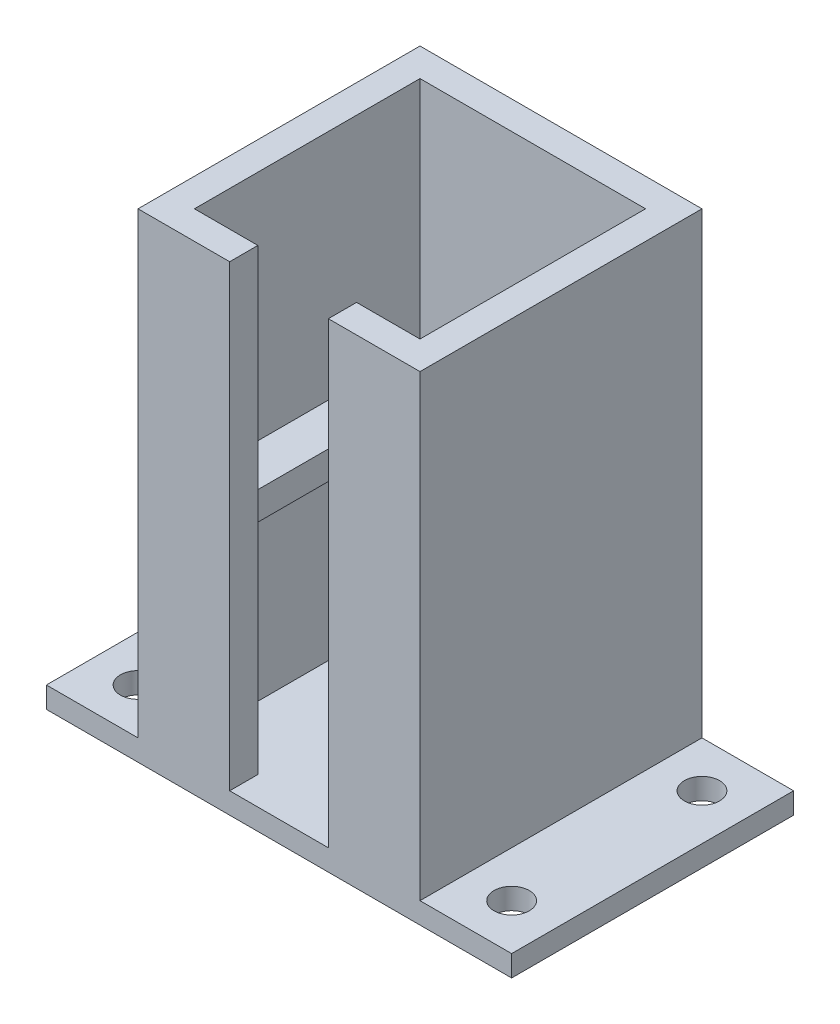
ISO-10303-21;
HEADER;
FILE_DESCRIPTION(('STEP AP214'),'2;1');
FILE_NAME('part.step','',(''),(''),'','','');
FILE_SCHEMA(('AUTOMOTIVE_DESIGN { 1 0 10303 214 1 1 1 1 }'));
ENDSEC;
DATA;
#1=APPLICATION_CONTEXT('core data for automotive mechanical design processes');
#2=APPLICATION_PROTOCOL_DEFINITION('international standard','automotive_design',2000,#1);
#3=PRODUCT_CONTEXT('',#1,'mechanical');
#4=PRODUCT('Part','Part','',(#3));
#5=PRODUCT_RELATED_PRODUCT_CATEGORY('part','',(#4));
#6=PRODUCT_DEFINITION_FORMATION('','',#4);
#7=PRODUCT_DEFINITION_CONTEXT('part definition',#1,'design');
#8=PRODUCT_DEFINITION('design','',#6,#7);
#9=PRODUCT_DEFINITION_SHAPE('','',#8);
#10=(LENGTH_UNIT() NAMED_UNIT(*) SI_UNIT(.MILLI.,.METRE.));
#11=(NAMED_UNIT(*) PLANE_ANGLE_UNIT() SI_UNIT($,.RADIAN.));
#12=(NAMED_UNIT(*) SI_UNIT($,.STERADIAN.) SOLID_ANGLE_UNIT());
#13=UNCERTAINTY_MEASURE_WITH_UNIT(LENGTH_MEASURE(1.E-05),#10,'distance_accuracy_value','');
#14=(GEOMETRIC_REPRESENTATION_CONTEXT(3) GLOBAL_UNCERTAINTY_ASSIGNED_CONTEXT((#13)) GLOBAL_UNIT_ASSIGNED_CONTEXT((#10,
#11,#12)) REPRESENTATION_CONTEXT('',''));
#15=CARTESIAN_POINT('',(0.,0.,0.));
#16=DIRECTION('',(0.,0.,1.));
#17=DIRECTION('',(1.,0.,0.));
#18=AXIS2_PLACEMENT_3D('',#15,#16,#17);
#19=CARTESIAN_POINT('',(-94.7040678384791,68.,-61.9948726358178));
#20=DIRECTION('',(0.,0.,-1.));
#21=DIRECTION('',(-1.,0.,0.));
#22=AXIS2_PLACEMENT_3D('',#19,#20,#21);
#23=PLANE('',#22);
#24=DIRECTION('',(-1.,0.,0.));
#25=VECTOR('',#24,1.);
#26=CARTESIAN_POINT('',(-62.7040678384791,35.,-61.9948726358178));
#27=LINE('',#26,#25);
#28=CARTESIAN_POINT('',(-62.7040678384791,35.,-61.9948726358178));
#29=VERTEX_POINT('',#28);
#30=CARTESIAN_POINT('',(-68.7040678384791,35.,-61.9948726358178));
#31=VERTEX_POINT('',#30);
#32=EDGE_CURVE('E294',#29,#31,#27,.T.);
#33=ORIENTED_EDGE('',*,*,#32,.F.);
#34=DIRECTION('',(0.,-1.,0.));
#35=VECTOR('',#34,1.);
#36=CARTESIAN_POINT('',(-62.7040678384791,68.,-61.9948726358178));
#37=LINE('',#36,#35);
#38=CARTESIAN_POINT('',(-62.7040678384791,68.,-61.9948726358178));
#39=VERTEX_POINT('',#38);
#40=EDGE_CURVE('E434',#39,#29,#37,.T.);
#41=ORIENTED_EDGE('',*,*,#40,.F.);
#42=DIRECTION('',(1.,0.,0.));
#43=VECTOR('',#42,1.);
#44=CARTESIAN_POINT('',(-94.7040678384791,68.,-61.9948726358178));
#45=LINE('',#44,#43);
#46=CARTESIAN_POINT('',(-94.7040678384791,68.,-61.9948726358178));
#47=VERTEX_POINT('',#46);
#48=EDGE_CURVE('E354',#47,#39,#45,.T.);
#49=ORIENTED_EDGE('',*,*,#48,.F.);
#50=DIRECTION('',(0.,-1.,0.));
#51=VECTOR('',#50,1.);
#52=CARTESIAN_POINT('',(-94.7040678384791,68.,-61.9948726358178));
#53=LINE('',#52,#51);
#54=CARTESIAN_POINT('',(-94.7040678384791,35.,-61.9948726358178));
#55=VERTEX_POINT('',#54);
#56=EDGE_CURVE('E439',#47,#55,#53,.T.);
#57=ORIENTED_EDGE('',*,*,#56,.T.);
#58=DIRECTION('',(-1.,0.,0.));
#59=VECTOR('',#58,1.);
#60=CARTESIAN_POINT('',(-94.7040678384791,35.,-61.9948726358178));
#61=LINE('',#60,#59);
#62=CARTESIAN_POINT('',(-88.7040678384791,35.,-61.9948726358178));
#63=VERTEX_POINT('',#62);
#64=EDGE_CURVE('E303',#63,#55,#61,.T.);
#65=ORIENTED_EDGE('',*,*,#64,.F.);
#66=DIRECTION('',(0.,1.,0.));
#67=VECTOR('',#66,1.);
#68=CARTESIAN_POINT('',(-88.7040678384791,35.,-61.9948726358178));
#69=LINE('',#68,#67);
#70=CARTESIAN_POINT('',(-88.7040678384791,31.,-61.9948726358178));
#71=VERTEX_POINT('',#70);
#72=EDGE_CURVE('E314',#71,#63,#69,.T.);
#73=ORIENTED_EDGE('',*,*,#72,.F.);
#74=DIRECTION('',(1.,0.,0.));
#75=VECTOR('',#74,1.);
#76=CARTESIAN_POINT('',(-88.7040678384791,31.,-61.9948726358178));
#77=LINE('',#76,#75);
#78=CARTESIAN_POINT('',(-94.7040678384791,31.,-61.9948726358178));
#79=VERTEX_POINT('',#78);
#80=EDGE_CURVE('E310',#79,#71,#77,.T.);
#81=ORIENTED_EDGE('',*,*,#80,.F.);
#82=CARTESIAN_POINT('',(-94.7040678384791,3.,-61.9948726358178));
#83=VERTEX_POINT('',#82);
#84=EDGE_CURVE('E438',#79,#83,#53,.T.);
#85=ORIENTED_EDGE('',*,*,#84,.T.);
#86=DIRECTION('',(1.,0.,0.));
#87=VECTOR('',#86,1.);
#88=CARTESIAN_POINT('',(-94.7040678384791,3.,-61.9948726358178));
#89=LINE('',#88,#87);
#90=CARTESIAN_POINT('',(-62.7040678384791,3.,-61.9948726358178));
#91=VERTEX_POINT('',#90);
#92=EDGE_CURVE('E391',#83,#91,#89,.T.);
#93=ORIENTED_EDGE('',*,*,#92,.T.);
#94=CARTESIAN_POINT('',(-62.7040678384791,31.,-61.9948726358178));
#95=VERTEX_POINT('',#94);
#96=EDGE_CURVE('E433',#95,#91,#37,.T.);
#97=ORIENTED_EDGE('',*,*,#96,.F.);
#98=DIRECTION('',(1.,0.,0.));
#99=VECTOR('',#98,1.);
#100=CARTESIAN_POINT('',(-68.7040678384791,31.,-61.9948726358178));
#101=LINE('',#100,#99);
#102=CARTESIAN_POINT('',(-68.7040678384791,31.,-61.9948726358178));
#103=VERTEX_POINT('',#102);
#104=EDGE_CURVE('E126',#103,#95,#101,.T.);
#105=ORIENTED_EDGE('',*,*,#104,.F.);
#106=DIRECTION('',(0.,-1.,0.));
#107=VECTOR('',#106,1.);
#108=CARTESIAN_POINT('',(-68.7040678384791,35.,-61.9948726358178));
#109=LINE('',#108,#107);
#110=EDGE_CURVE('E121',#31,#103,#109,.T.);
#111=ORIENTED_EDGE('',*,*,#110,.F.);
#112=EDGE_LOOP('',(#33,#41,#49,#57,#65,#73,#81,#85,#93,#97,#105,#111));
#113=FACE_BOUND('',#112,.T.);
#114=ADVANCED_FACE('F105',(#113),#23,.F.);
#115=CARTESIAN_POINT('',(-62.7040678384791,68.,-61.9948726358178));
#116=DIRECTION('',(1.,0.,0.));
#117=DIRECTION('',(0.,0.,-1.));
#118=AXIS2_PLACEMENT_3D('',#115,#116,#117);
#119=PLANE('',#118);
#120=DIRECTION('',(0.,0.,-1.));
#121=VECTOR('',#120,1.);
#122=CARTESIAN_POINT('',(-62.7040678384791,35.,-29.9948726358178));
#123=LINE('',#122,#121);
#124=CARTESIAN_POINT('',(-62.7040678384791,35.,-29.9948726358178));
#125=VERTEX_POINT('',#124);
#126=EDGE_CURVE('E588',#125,#29,#123,.T.);
#127=ORIENTED_EDGE('',*,*,#126,.F.);
#128=DIRECTION('',(0.,-1.,0.));
#129=VECTOR('',#128,1.);
#130=CARTESIAN_POINT('',(-62.7040678384791,68.,-29.9948726358178));
#131=LINE('',#130,#129);
#132=CARTESIAN_POINT('',(-62.7040678384791,68.,-29.9948726358178));
#133=VERTEX_POINT('',#132);
#134=EDGE_CURVE('E430',#133,#125,#131,.T.);
#135=ORIENTED_EDGE('',*,*,#134,.F.);
#136=DIRECTION('',(0.,0.,1.));
#137=VECTOR('',#136,1.);
#138=CARTESIAN_POINT('',(-62.7040678384791,68.,-61.9948726358178));
#139=LINE('',#138,#137);
#140=EDGE_CURVE('E357',#39,#133,#139,.T.);
#141=ORIENTED_EDGE('',*,*,#140,.F.);
#142=ORIENTED_EDGE('',*,*,#40,.T.);
#143=EDGE_LOOP('',(#127,#135,#141,#142));
#144=FACE_BOUND('',#143,.T.);
#145=ADVANCED_FACE('F594',(#144),#119,.F.);
#146=DIRECTION('',(0.,0.,-1.));
#147=VECTOR('',#146,1.);
#148=CARTESIAN_POINT('',(-62.7040678384791,31.,-29.9948726358178));
#149=LINE('',#148,#147);
#150=CARTESIAN_POINT('',(-62.7040678384791,31.,-29.9948726358178));
#151=VERTEX_POINT('',#150);
#152=EDGE_CURVE('E284',#151,#95,#149,.T.);
#153=ORIENTED_EDGE('',*,*,#152,.T.);
#154=ORIENTED_EDGE('',*,*,#96,.T.);
#155=DIRECTION('',(0.,0.,1.));
#156=VECTOR('',#155,1.);
#157=CARTESIAN_POINT('',(-62.7040678384791,3.,-61.9948726358178));
#158=LINE('',#157,#156);
#159=CARTESIAN_POINT('',(-62.7040678384791,3.,-29.9948726358178));
#160=VERTEX_POINT('',#159);
#161=EDGE_CURVE('E395',#91,#160,#158,.T.);
#162=ORIENTED_EDGE('',*,*,#161,.T.);
#163=EDGE_CURVE('E429',#151,#160,#131,.T.);
#164=ORIENTED_EDGE('',*,*,#163,.F.);
#165=EDGE_LOOP('',(#153,#154,#162,#164));
#166=FACE_BOUND('',#165,.T.);
#167=ADVANCED_FACE('F577',(#166),#119,.F.);
#168=CARTESIAN_POINT('',(-62.7040678384791,68.,-29.9948726358178));
#169=DIRECTION('',(0.,0.,1.));
#170=DIRECTION('',(1.,0.,0.));
#171=AXIS2_PLACEMENT_3D('',#168,#169,#170);
#172=PLANE('',#171);
#173=DIRECTION('',(-1.,0.,0.));
#174=VECTOR('',#173,1.);
#175=CARTESIAN_POINT('',(-62.7040678384791,35.,-29.9948726358178));
#176=LINE('',#175,#174);
#177=CARTESIAN_POINT('',(-68.7040678384791,35.,-29.9948726358178));
#178=VERTEX_POINT('',#177);
#179=EDGE_CURVE('E273',#125,#178,#176,.T.);
#180=ORIENTED_EDGE('',*,*,#179,.T.);
#181=DIRECTION('',(0.,-1.,0.));
#182=VECTOR('',#181,1.);
#183=CARTESIAN_POINT('',(-68.7040678384791,35.,-29.9948726358178));
#184=LINE('',#183,#182);
#185=CARTESIAN_POINT('',(-68.7040678384791,31.,-29.9948726358178));
#186=VERTEX_POINT('',#185);
#187=EDGE_CURVE('E265',#178,#186,#184,.T.);
#188=ORIENTED_EDGE('',*,*,#187,.T.);
#189=DIRECTION('',(1.,0.,0.));
#190=VECTOR('',#189,1.);
#191=CARTESIAN_POINT('',(-68.7040678384791,31.,-29.9948726358178));
#192=LINE('',#191,#190);
#193=EDGE_CURVE('E269',#186,#151,#192,.T.);
#194=ORIENTED_EDGE('',*,*,#193,.T.);
#195=ORIENTED_EDGE('',*,*,#163,.T.);
#196=DIRECTION('',(-1.,0.,0.));
#197=VECTOR('',#196,1.);
#198=CARTESIAN_POINT('',(-62.7040678384791,3.,-29.9948726358178));
#199=LINE('',#198,#197);
#200=CARTESIAN_POINT('',(-71.7040678384791,3.,-29.9948726358178));
#201=VERTEX_POINT('',#200);
#202=EDGE_CURVE('E399',#160,#201,#199,.T.);
#203=ORIENTED_EDGE('',*,*,#202,.T.);
#204=DIRECTION('',(0.,-1.,0.));
#205=VECTOR('',#204,1.);
#206=CARTESIAN_POINT('',(-71.7040678384791,68.,-29.9948726358178));
#207=LINE('',#206,#205);
#208=CARTESIAN_POINT('',(-71.7040678384791,68.,-29.9948726358178));
#209=VERTEX_POINT('',#208);
#210=EDGE_CURVE('E425',#209,#201,#207,.T.);
#211=ORIENTED_EDGE('',*,*,#210,.F.);
#212=DIRECTION('',(-1.,0.,0.));
#213=VECTOR('',#212,1.);
#214=CARTESIAN_POINT('',(-62.7040678384791,68.,-29.9948726358178));
#215=LINE('',#214,#213);
#216=EDGE_CURVE('E360',#133,#209,#215,.T.);
#217=ORIENTED_EDGE('',*,*,#216,.F.);
#218=ORIENTED_EDGE('',*,*,#134,.T.);
#219=EDGE_LOOP('',(#180,#188,#194,#195,#203,#211,#217,#218));
#220=FACE_BOUND('',#219,.T.);
#221=ADVANCED_FACE('F267',(#220),#172,.F.);
#222=CARTESIAN_POINT('',(-94.7040678384791,68.,-29.9948726358178));
#223=DIRECTION('',(0.,0.,1.));
#224=DIRECTION('',(1.,0.,0.));
#225=AXIS2_PLACEMENT_3D('',#222,#223,#224);
#226=PLANE('',#225);
#227=DIRECTION('',(1.,0.,0.));
#228=VECTOR('',#227,1.);
#229=CARTESIAN_POINT('',(-88.7040678384791,31.,-29.9948726358178));
#230=LINE('',#229,#228);
#231=CARTESIAN_POINT('',(-94.7040678384791,31.,-29.9948726358178));
#232=VERTEX_POINT('',#231);
#233=CARTESIAN_POINT('',(-88.7040678384791,31.,-29.9948726358178));
#234=VERTEX_POINT('',#233);
#235=EDGE_CURVE('E299',#232,#234,#230,.T.);
#236=ORIENTED_EDGE('',*,*,#235,.T.);
#237=DIRECTION('',(0.,1.,0.));
#238=VECTOR('',#237,1.);
#239=CARTESIAN_POINT('',(-88.7040678384791,35.,-29.9948726358178));
#240=LINE('',#239,#238);
#241=CARTESIAN_POINT('',(-88.7040678384791,35.,-29.9948726358178));
#242=VERTEX_POINT('',#241);
#243=EDGE_CURVE('E302',#234,#242,#240,.T.);
#244=ORIENTED_EDGE('',*,*,#243,.T.);
#245=DIRECTION('',(-1.,0.,0.));
#246=VECTOR('',#245,1.);
#247=CARTESIAN_POINT('',(-94.7040678384791,35.,-29.9948726358178));
#248=LINE('',#247,#246);
#249=CARTESIAN_POINT('',(-94.7040678384791,35.,-29.9948726358178));
#250=VERTEX_POINT('',#249);
#251=EDGE_CURVE('E306',#242,#250,#248,.T.);
#252=ORIENTED_EDGE('',*,*,#251,.T.);
#253=DIRECTION('',(0.,-1.,0.));
#254=VECTOR('',#253,1.);
#255=CARTESIAN_POINT('',(-94.7040678384791,68.,-29.9948726358178));
#256=LINE('',#255,#254);
#257=CARTESIAN_POINT('',(-94.7040678384791,68.,-29.9948726358178));
#258=VERTEX_POINT('',#257);
#259=EDGE_CURVE('E443',#258,#250,#256,.T.);
#260=ORIENTED_EDGE('',*,*,#259,.F.);
#261=DIRECTION('',(-1.,0.,0.));
#262=VECTOR('',#261,1.);
#263=CARTESIAN_POINT('',(-94.7040678384791,68.,-29.9948726358178));
#264=LINE('',#263,#262);
#265=CARTESIAN_POINT('',(-85.7040678384792,68.,-29.9948726358178));
#266=VERTEX_POINT('',#265);
#267=EDGE_CURVE('E348',#266,#258,#264,.T.);
#268=ORIENTED_EDGE('',*,*,#267,.F.);
#269=DIRECTION('',(0.,-1.,0.));
#270=VECTOR('',#269,1.);
#271=CARTESIAN_POINT('',(-85.7040678384792,68.,-29.9948726358178));
#272=LINE('',#271,#270);
#273=CARTESIAN_POINT('',(-85.7040678384792,3.,-29.9948726358178));
#274=VERTEX_POINT('',#273);
#275=EDGE_CURVE('E447',#266,#274,#272,.T.);
#276=ORIENTED_EDGE('',*,*,#275,.T.);
#277=DIRECTION('',(-1.,0.,0.));
#278=VECTOR('',#277,1.);
#279=CARTESIAN_POINT('',(-94.7040678384791,3.,-29.9948726358178));
#280=LINE('',#279,#278);
#281=CARTESIAN_POINT('',(-94.7040678384791,3.,-29.9948726358178));
#282=VERTEX_POINT('',#281);
#283=EDGE_CURVE('E383',#274,#282,#280,.T.);
#284=ORIENTED_EDGE('',*,*,#283,.T.);
#285=EDGE_CURVE('E442',#232,#282,#256,.T.);
#286=ORIENTED_EDGE('',*,*,#285,.F.);
#287=EDGE_LOOP('',(#236,#244,#252,#260,#268,#276,#284,#286));
#288=FACE_BOUND('',#287,.T.);
#289=ADVANCED_FACE('F653',(#288),#226,.F.);
#290=CARTESIAN_POINT('',(-94.7040678384791,68.,-61.9948726358178));
#291=DIRECTION('',(-1.,0.,0.));
#292=DIRECTION('',(0.,0.,1.));
#293=AXIS2_PLACEMENT_3D('',#290,#291,#292);
#294=PLANE('',#293);
#295=DIRECTION('',(0.,0.,-1.));
#296=VECTOR('',#295,1.);
#297=CARTESIAN_POINT('',(-94.7040678384791,31.,-29.9948726358178));
#298=LINE('',#297,#296);
#299=EDGE_CURVE('E332',#232,#79,#298,.T.);
#300=ORIENTED_EDGE('',*,*,#299,.F.);
#301=ORIENTED_EDGE('',*,*,#285,.T.);
#302=DIRECTION('',(0.,0.,-1.));
#303=VECTOR('',#302,1.);
#304=CARTESIAN_POINT('',(-94.7040678384791,3.,-61.9948726358178));
#305=LINE('',#304,#303);
#306=EDGE_CURVE('E387',#282,#83,#305,.T.);
#307=ORIENTED_EDGE('',*,*,#306,.T.);
#308=ORIENTED_EDGE('',*,*,#84,.F.);
#309=EDGE_LOOP('',(#300,#301,#307,#308));
#310=FACE_BOUND('',#309,.T.);
#311=ADVANCED_FACE('F617',(#310),#294,.F.);
#312=DIRECTION('',(0.,0.,-1.));
#313=VECTOR('',#312,1.);
#314=CARTESIAN_POINT('',(-94.7040678384791,35.,-29.9948726358178));
#315=LINE('',#314,#313);
#316=EDGE_CURVE('E309',#250,#55,#315,.T.);
#317=ORIENTED_EDGE('',*,*,#316,.T.);
#318=ORIENTED_EDGE('',*,*,#56,.F.);
#319=DIRECTION('',(0.,0.,-1.));
#320=VECTOR('',#319,1.);
#321=CARTESIAN_POINT('',(-94.7040678384791,68.,-61.9948726358178));
#322=LINE('',#321,#320);
#323=EDGE_CURVE('E351',#258,#47,#322,.T.);
#324=ORIENTED_EDGE('',*,*,#323,.F.);
#325=ORIENTED_EDGE('',*,*,#259,.T.);
#326=EDGE_LOOP('',(#317,#318,#324,#325));
#327=FACE_BOUND('',#326,.T.);
#328=ADVANCED_FACE('F602',(#327),#294,.F.);
#329=CARTESIAN_POINT('',(0.,3.,0.));
#330=DIRECTION('',(0.,1.,0.));
#331=DIRECTION('',(0.,0.,1.));
#332=AXIS2_PLACEMENT_3D('',#329,#330,#331);
#333=PLANE('',#332);
#334=DIRECTION('',(0.,0.,1.));
#335=VECTOR('',#334,1.);
#336=CARTESIAN_POINT('',(-98.7040678384791,3.,-65.9948726358179));
#337=LINE('',#336,#335);
#338=CARTESIAN_POINT('',(-98.7040678384791,3.,-65.9948726358179));
#339=VERTEX_POINT('',#338);
#340=CARTESIAN_POINT('',(-98.7040678384791,3.,-25.9948726358178));
#341=VERTEX_POINT('',#340);
#342=EDGE_CURVE('E336',#339,#341,#337,.T.);
#343=ORIENTED_EDGE('',*,*,#342,.F.);
#344=DIRECTION('',(-1.,0.,0.));
#345=VECTOR('',#344,1.);
#346=CARTESIAN_POINT('',(-45.7040678384791,3.,-65.9948726358179));
#347=LINE('',#346,#345);
#348=CARTESIAN_POINT('',(-111.704067838479,3.,-65.9948726358179));
#349=VERTEX_POINT('',#348);
#350=EDGE_CURVE('E496',#339,#349,#347,.T.);
#351=ORIENTED_EDGE('',*,*,#350,.T.);
#352=DIRECTION('',(0.,0.,1.));
#353=VECTOR('',#352,1.);
#354=CARTESIAN_POINT('',(-111.704067838479,3.,-65.9948726358179));
#355=LINE('',#354,#353);
#356=CARTESIAN_POINT('',(-111.704067838479,3.,-25.9948726358178));
#357=VERTEX_POINT('',#356);
#358=EDGE_CURVE('E501',#349,#357,#355,.T.);
#359=ORIENTED_EDGE('',*,*,#358,.T.);
#360=DIRECTION('',(1.,0.,0.));
#361=VECTOR('',#360,1.);
#362=CARTESIAN_POINT('',(-111.704067838479,3.,-25.9948726358178));
#363=LINE('',#362,#361);
#364=EDGE_CURVE('E505',#357,#341,#363,.T.);
#365=ORIENTED_EDGE('',*,*,#364,.T.);
#366=EDGE_LOOP('',(#343,#351,#359,#365));
#367=FACE_BOUND('',#366,.T.);
#368=CARTESIAN_POINT('',(-105.204067838479,3.,-59.4948726358179));
#369=DIRECTION('',(0.,1.,0.));
#370=DIRECTION('',(0.,0.,1.));
#371=AXIS2_PLACEMENT_3D('',#368,#369,#370);
#372=CIRCLE('',#371,2.5);
#373=CARTESIAN_POINT('',(-105.204067838479,3.,-56.9948726358179));
#374=VERTEX_POINT('',#373);
#375=EDGE_CURVE('E476',#374,#374,#372,.T.);
#376=ORIENTED_EDGE('',*,*,#375,.F.);
#377=EDGE_LOOP('',(#376));
#378=FACE_BOUND('',#377,.T.);
#379=CARTESIAN_POINT('',(-105.204067838479,3.,-32.4948726358178));
#380=DIRECTION('',(0.,1.,0.));
#381=DIRECTION('',(0.,0.,1.));
#382=AXIS2_PLACEMENT_3D('',#379,#380,#381);
#383=CIRCLE('',#382,2.5);
#384=CARTESIAN_POINT('',(-105.204067838479,3.,-29.9948726358178));
#385=VERTEX_POINT('',#384);
#386=EDGE_CURVE('E484',#385,#385,#383,.T.);
#387=ORIENTED_EDGE('',*,*,#386,.F.);
#388=EDGE_LOOP('',(#387));
#389=FACE_BOUND('',#388,.T.);
#390=ADVANCED_FACE('F623',(#367,#378,#389),#333,.T.);
#391=DIRECTION('',(0.,0.,-1.));
#392=VECTOR('',#391,1.);
#393=CARTESIAN_POINT('',(-58.7040678384791,3.,-65.9948726358179));
#394=LINE('',#393,#392);
#395=CARTESIAN_POINT('',(-58.7040678384791,3.,-25.9948726358178));
#396=VERTEX_POINT('',#395);
#397=CARTESIAN_POINT('',(-58.7040678384791,3.,-65.9948726358179));
#398=VERTEX_POINT('',#397);
#399=EDGE_CURVE('E342',#396,#398,#394,.T.);
#400=ORIENTED_EDGE('',*,*,#399,.F.);
#401=CARTESIAN_POINT('',(-45.7040678384791,3.,-25.9948726358178));
#402=VERTEX_POINT('',#401);
#403=EDGE_CURVE('E504',#396,#402,#363,.T.);
#404=ORIENTED_EDGE('',*,*,#403,.T.);
#405=DIRECTION('',(0.,0.,-1.));
#406=VECTOR('',#405,1.);
#407=CARTESIAN_POINT('',(-45.7040678384791,3.,-25.9948726358178));
#408=LINE('',#407,#406);
#409=CARTESIAN_POINT('',(-45.7040678384791,3.,-65.9948726358179));
#410=VERTEX_POINT('',#409);
#411=EDGE_CURVE('E492',#402,#410,#408,.T.);
#412=ORIENTED_EDGE('',*,*,#411,.T.);
#413=EDGE_CURVE('E498',#410,#398,#347,.T.);
#414=ORIENTED_EDGE('',*,*,#413,.T.);
#415=EDGE_LOOP('',(#400,#404,#412,#414));
#416=FACE_BOUND('',#415,.T.);
#417=CARTESIAN_POINT('',(-52.2040678384792,3.,-59.4948726358179));
#418=DIRECTION('',(0.,1.,0.));
#419=DIRECTION('',(0.,0.,1.));
#420=AXIS2_PLACEMENT_3D('',#417,#418,#419);
#421=CIRCLE('',#420,2.5);
#422=CARTESIAN_POINT('',(-52.2040678384792,3.,-56.9948726358179));
#423=VERTEX_POINT('',#422);
#424=EDGE_CURVE('E468',#423,#423,#421,.T.);
#425=ORIENTED_EDGE('',*,*,#424,.F.);
#426=EDGE_LOOP('',(#425));
#427=FACE_BOUND('',#426,.T.);
#428=CARTESIAN_POINT('',(-52.2040678384792,3.,-32.4948726358178));
#429=DIRECTION('',(0.,1.,0.));
#430=DIRECTION('',(0.,0.,1.));
#431=AXIS2_PLACEMENT_3D('',#428,#429,#430);
#432=CIRCLE('',#431,2.5);
#433=CARTESIAN_POINT('',(-52.2040678384792,3.,-29.9948726358178));
#434=VERTEX_POINT('',#433);
#435=EDGE_CURVE('E460',#434,#434,#432,.T.);
#436=ORIENTED_EDGE('',*,*,#435,.F.);
#437=EDGE_LOOP('',(#436));
#438=FACE_BOUND('',#437,.T.);
#439=ADVANCED_FACE('F551',(#416,#427,#438),#333,.T.);
#440=DIRECTION('',(0.,0.,1.));
#441=VECTOR('',#440,1.);
#442=CARTESIAN_POINT('',(-71.7040678384791,3.,-29.9948726358178));
#443=LINE('',#442,#441);
#444=CARTESIAN_POINT('',(-71.7040678384791,3.,-25.9948726358178));
#445=VERTEX_POINT('',#444);
#446=EDGE_CURVE('E403',#201,#445,#443,.T.);
#447=ORIENTED_EDGE('',*,*,#446,.F.);
#448=ORIENTED_EDGE('',*,*,#202,.F.);
#449=ORIENTED_EDGE('',*,*,#161,.F.);
#450=ORIENTED_EDGE('',*,*,#92,.F.);
#451=ORIENTED_EDGE('',*,*,#306,.F.);
#452=ORIENTED_EDGE('',*,*,#283,.F.);
#453=DIRECTION('',(0.,0.,-1.));
#454=VECTOR('',#453,1.);
#455=CARTESIAN_POINT('',(-85.7040678384792,3.,-29.9948726358178));
#456=LINE('',#455,#454);
#457=CARTESIAN_POINT('',(-85.7040678384792,3.,-25.9948726358178));
#458=VERTEX_POINT('',#457);
#459=EDGE_CURVE('E379',#458,#274,#456,.T.);
#460=ORIENTED_EDGE('',*,*,#459,.F.);
#461=EDGE_CURVE('E509',#458,#445,#363,.T.);
#462=ORIENTED_EDGE('',*,*,#461,.T.);
#463=EDGE_LOOP('',(#447,#448,#449,#450,#451,#452,#460,#462));
#464=FACE_BOUND('',#463,.T.);
#465=ADVANCED_FACE('F558',(#464),#333,.T.);
#466=CARTESIAN_POINT('',(0.,0.,0.));
#467=DIRECTION('',(0.,1.,0.));
#468=DIRECTION('',(0.,0.,1.));
#469=AXIS2_PLACEMENT_3D('',#466,#467,#468);
#470=PLANE('',#469);
#471=DIRECTION('',(0.,0.,-1.));
#472=VECTOR('',#471,1.);
#473=CARTESIAN_POINT('',(-45.7040678384791,0.,-25.9948726358178));
#474=LINE('',#473,#472);
#475=CARTESIAN_POINT('',(-45.7040678384791,0.,-25.9948726358178));
#476=VERTEX_POINT('',#475);
#477=CARTESIAN_POINT('',(-45.7040678384791,0.,-65.9948726358179));
#478=VERTEX_POINT('',#477);
#479=EDGE_CURVE('E488',#476,#478,#474,.T.);
#480=ORIENTED_EDGE('',*,*,#479,.F.);
#481=DIRECTION('',(1.,0.,0.));
#482=VECTOR('',#481,1.);
#483=CARTESIAN_POINT('',(-111.704067838479,0.,-25.9948726358178));
#484=LINE('',#483,#482);
#485=CARTESIAN_POINT('',(-111.704067838479,0.,-25.9948726358178));
#486=VERTEX_POINT('',#485);
#487=EDGE_CURVE('E497',#486,#476,#484,.T.);
#488=ORIENTED_EDGE('',*,*,#487,.F.);
#489=DIRECTION('',(0.,0.,1.));
#490=VECTOR('',#489,1.);
#491=CARTESIAN_POINT('',(-111.704067838479,0.,-65.9948726358179));
#492=LINE('',#491,#490);
#493=CARTESIAN_POINT('',(-111.704067838479,0.,-65.9948726358179));
#494=VERTEX_POINT('',#493);
#495=EDGE_CURVE('E516',#494,#486,#492,.T.);
#496=ORIENTED_EDGE('',*,*,#495,.F.);
#497=DIRECTION('',(-1.,0.,0.));
#498=VECTOR('',#497,1.);
#499=CARTESIAN_POINT('',(-45.7040678384791,0.,-65.9948726358179));
#500=LINE('',#499,#498);
#501=EDGE_CURVE('E513',#478,#494,#500,.T.);
#502=ORIENTED_EDGE('',*,*,#501,.F.);
#503=EDGE_LOOP('',(#480,#488,#496,#502));
#504=FACE_BOUND('',#503,.T.);
#505=CARTESIAN_POINT('',(-105.204067838479,0.,-32.4948726358178));
#506=DIRECTION('',(0.,1.,0.));
#507=DIRECTION('',(0.,0.,1.));
#508=AXIS2_PLACEMENT_3D('',#505,#506,#507);
#509=CIRCLE('',#508,2.5);
#510=CARTESIAN_POINT('',(-105.204067838479,0.,-29.9948726358178));
#511=VERTEX_POINT('',#510);
#512=EDGE_CURVE('E480',#511,#511,#509,.T.);
#513=ORIENTED_EDGE('',*,*,#512,.T.);
#514=EDGE_LOOP('',(#513));
#515=FACE_BOUND('',#514,.T.);
#516=CARTESIAN_POINT('',(-105.204067838479,0.,-59.4948726358179));
#517=DIRECTION('',(0.,1.,0.));
#518=DIRECTION('',(0.,0.,1.));
#519=AXIS2_PLACEMENT_3D('',#516,#517,#518);
#520=CIRCLE('',#519,2.5);
#521=CARTESIAN_POINT('',(-105.204067838479,0.,-56.9948726358179));
#522=VERTEX_POINT('',#521);
#523=EDGE_CURVE('E472',#522,#522,#520,.T.);
#524=ORIENTED_EDGE('',*,*,#523,.T.);
#525=EDGE_LOOP('',(#524));
#526=FACE_BOUND('',#525,.T.);
#527=CARTESIAN_POINT('',(-52.2040678384792,0.,-59.4948726358179));
#528=DIRECTION('',(0.,1.,0.));
#529=DIRECTION('',(0.,0.,1.));
#530=AXIS2_PLACEMENT_3D('',#527,#528,#529);
#531=CIRCLE('',#530,2.5);
#532=CARTESIAN_POINT('',(-52.2040678384792,0.,-56.9948726358179));
#533=VERTEX_POINT('',#532);
#534=EDGE_CURVE('E464',#533,#533,#531,.T.);
#535=ORIENTED_EDGE('',*,*,#534,.T.);
#536=EDGE_LOOP('',(#535));
#537=FACE_BOUND('',#536,.T.);
#538=CARTESIAN_POINT('',(-52.2040678384792,0.,-32.4948726358178));
#539=DIRECTION('',(0.,1.,0.));
#540=DIRECTION('',(0.,0.,1.));
#541=AXIS2_PLACEMENT_3D('',#538,#539,#540);
#542=CIRCLE('',#541,2.5);
#543=CARTESIAN_POINT('',(-52.2040678384792,0.,-29.9948726358178));
#544=VERTEX_POINT('',#543);
#545=EDGE_CURVE('E459',#544,#544,#542,.T.);
#546=ORIENTED_EDGE('',*,*,#545,.T.);
#547=EDGE_LOOP('',(#546));
#548=FACE_BOUND('',#547,.T.);
#549=ADVANCED_FACE('F540',(#504,#515,#526,#537,#548),#470,.F.);
#550=CARTESIAN_POINT('',(-45.7040678384791,3.,-25.9948726358178));
#551=DIRECTION('',(-1.,0.,0.));
#552=DIRECTION('',(0.,0.,1.));
#553=AXIS2_PLACEMENT_3D('',#550,#551,#552);
#554=PLANE('',#553);
#555=ORIENTED_EDGE('',*,*,#479,.T.);
#556=DIRECTION('',(0.,-1.,0.));
#557=VECTOR('',#556,1.);
#558=CARTESIAN_POINT('',(-45.7040678384791,3.,-65.9948726358179));
#559=LINE('',#558,#557);
#560=EDGE_CURVE('E12',#410,#478,#559,.T.);
#561=ORIENTED_EDGE('',*,*,#560,.F.);
#562=ORIENTED_EDGE('',*,*,#411,.F.);
#563=DIRECTION('',(0.,-1.,0.));
#564=VECTOR('',#563,1.);
#565=CARTESIAN_POINT('',(-45.7040678384791,3.,-25.9948726358178));
#566=LINE('',#565,#564);
#567=EDGE_CURVE('E508',#402,#476,#566,.T.);
#568=ORIENTED_EDGE('',*,*,#567,.T.);
#569=EDGE_LOOP('',(#555,#561,#562,#568));
#570=FACE_BOUND('',#569,.T.);
#571=ADVANCED_FACE('F107',(#570),#554,.F.);
#572=CARTESIAN_POINT('',(-45.7040678384791,3.,-65.9948726358179));
#573=DIRECTION('',(0.,0.,1.));
#574=DIRECTION('',(1.,0.,0.));
#575=AXIS2_PLACEMENT_3D('',#572,#573,#574);
#576=PLANE('',#575);
#577=ORIENTED_EDGE('',*,*,#501,.T.);
#578=DIRECTION('',(0.,-1.,0.));
#579=VECTOR('',#578,1.);
#580=CARTESIAN_POINT('',(-111.704067838479,3.,-65.9948726358179));
#581=LINE('',#580,#579);
#582=EDGE_CURVE('E114',#349,#494,#581,.T.);
#583=ORIENTED_EDGE('',*,*,#582,.F.);
#584=ORIENTED_EDGE('',*,*,#350,.F.);
#585=DIRECTION('',(0.,-1.,0.));
#586=VECTOR('',#585,1.);
#587=CARTESIAN_POINT('',(-98.7040678384791,68.,-65.9948726358179));
#588=LINE('',#587,#586);
#589=CARTESIAN_POINT('',(-98.7040678384791,68.,-65.9948726358179));
#590=VERTEX_POINT('',#589);
#591=EDGE_CURVE('E375',#590,#339,#588,.T.);
#592=ORIENTED_EDGE('',*,*,#591,.F.);
#593=DIRECTION('',(-1.,0.,0.));
#594=VECTOR('',#593,1.);
#595=CARTESIAN_POINT('',(-98.7040678384791,68.,-65.9948726358179));
#596=LINE('',#595,#594);
#597=CARTESIAN_POINT('',(-58.7040678384791,68.,-65.9948726358179));
#598=VERTEX_POINT('',#597);
#599=EDGE_CURVE('E372',#598,#590,#596,.T.);
#600=ORIENTED_EDGE('',*,*,#599,.F.);
#601=DIRECTION('',(0.,-1.,0.));
#602=VECTOR('',#601,1.);
#603=CARTESIAN_POINT('',(-58.7040678384791,68.,-65.9948726358179));
#604=LINE('',#603,#602);
#605=EDGE_CURVE('E413',#598,#398,#604,.T.);
#606=ORIENTED_EDGE('',*,*,#605,.T.);
#607=ORIENTED_EDGE('',*,*,#413,.F.);
#608=ORIENTED_EDGE('',*,*,#560,.T.);
#609=EDGE_LOOP('',(#577,#583,#584,#592,#600,#606,#607,#608));
#610=FACE_BOUND('',#609,.T.);
#611=ADVANCED_FACE('F626',(#610),#576,.F.);
#612=CARTESIAN_POINT('',(-111.704067838479,3.,-65.9948726358179));
#613=DIRECTION('',(1.,0.,0.));
#614=DIRECTION('',(0.,0.,-1.));
#615=AXIS2_PLACEMENT_3D('',#612,#613,#614);
#616=PLANE('',#615);
#617=ORIENTED_EDGE('',*,*,#495,.T.);
#618=DIRECTION('',(0.,-1.,0.));
#619=VECTOR('',#618,1.);
#620=CARTESIAN_POINT('',(-111.704067838479,3.,-25.9948726358178));
#621=LINE('',#620,#619);
#622=EDGE_CURVE('E524',#357,#486,#621,.T.);
#623=ORIENTED_EDGE('',*,*,#622,.F.);
#624=ORIENTED_EDGE('',*,*,#358,.F.);
#625=ORIENTED_EDGE('',*,*,#582,.T.);
#626=EDGE_LOOP('',(#617,#623,#624,#625));
#627=FACE_BOUND('',#626,.T.);
#628=ADVANCED_FACE('F533',(#627),#616,.F.);
#629=CARTESIAN_POINT('',(-111.704067838479,3.,-25.9948726358178));
#630=DIRECTION('',(0.,0.,-1.));
#631=DIRECTION('',(-1.,0.,0.));
#632=AXIS2_PLACEMENT_3D('',#629,#630,#631);
#633=PLANE('',#632);
#634=ORIENTED_EDGE('',*,*,#487,.T.);
#635=ORIENTED_EDGE('',*,*,#567,.F.);
#636=ORIENTED_EDGE('',*,*,#403,.F.);
#637=DIRECTION('',(0.,-1.,0.));
#638=VECTOR('',#637,1.);
#639=CARTESIAN_POINT('',(-58.7040678384791,68.,-25.9948726358178));
#640=LINE('',#639,#638);
#641=CARTESIAN_POINT('',(-58.7040678384791,68.,-25.9948726358178));
#642=VERTEX_POINT('',#641);
#643=EDGE_CURVE('E417',#642,#396,#640,.T.);
#644=ORIENTED_EDGE('',*,*,#643,.F.);
#645=DIRECTION('',(1.,0.,0.));
#646=VECTOR('',#645,1.);
#647=CARTESIAN_POINT('',(-71.7040678384791,68.,-25.9948726358178));
#648=LINE('',#647,#646);
#649=CARTESIAN_POINT('',(-71.7040678384791,68.,-25.9948726358178));
#650=VERTEX_POINT('',#649);
#651=EDGE_CURVE('E366',#650,#642,#648,.T.);
#652=ORIENTED_EDGE('',*,*,#651,.F.);
#653=DIRECTION('',(0.,-1.,0.));
#654=VECTOR('',#653,1.);
#655=CARTESIAN_POINT('',(-71.7040678384791,68.,-25.9948726358178));
#656=LINE('',#655,#654);
#657=EDGE_CURVE('E421',#650,#445,#656,.T.);
#658=ORIENTED_EDGE('',*,*,#657,.T.);
#659=ORIENTED_EDGE('',*,*,#461,.F.);
#660=DIRECTION('',(0.,-1.,0.));
#661=VECTOR('',#660,1.);
#662=CARTESIAN_POINT('',(-85.7040678384792,68.,-25.9948726358178));
#663=LINE('',#662,#661);
#664=CARTESIAN_POINT('',(-85.7040678384792,68.,-25.9948726358178));
#665=VERTEX_POINT('',#664);
#666=EDGE_CURVE('E451',#665,#458,#663,.T.);
#667=ORIENTED_EDGE('',*,*,#666,.F.);
#668=DIRECTION('',(1.,0.,0.));
#669=VECTOR('',#668,1.);
#670=CARTESIAN_POINT('',(-85.7040678384792,68.,-25.9948726358178));
#671=LINE('',#670,#669);
#672=CARTESIAN_POINT('',(-98.7040678384791,68.,-25.9948726358178));
#673=VERTEX_POINT('',#672);
#674=EDGE_CURVE('E341',#673,#665,#671,.T.);
#675=ORIENTED_EDGE('',*,*,#674,.F.);
#676=DIRECTION('',(0.,-1.,0.));
#677=VECTOR('',#676,1.);
#678=CARTESIAN_POINT('',(-98.7040678384791,68.,-25.9948726358178));
#679=LINE('',#678,#677);
#680=EDGE_CURVE('E455',#673,#341,#679,.T.);
#681=ORIENTED_EDGE('',*,*,#680,.T.);
#682=ORIENTED_EDGE('',*,*,#364,.F.);
#683=ORIENTED_EDGE('',*,*,#622,.T.);
#684=EDGE_LOOP('',(#634,#635,#636,#644,#652,#658,#659,#667,#675,#681,#682,#683));
#685=FACE_BOUND('',#684,.T.);
#686=ADVANCED_FACE('F544',(#685),#633,.F.);
#687=CARTESIAN_POINT('',(-105.204067838479,3.,-32.4948726358178));
#688=DIRECTION('',(0.,-1.,0.));
#689=DIRECTION('',(0.,0.,-1.));
#690=AXIS2_PLACEMENT_3D('',#687,#688,#689);
#691=CYLINDRICAL_SURFACE('',#690,2.5);
#692=ORIENTED_EDGE('',*,*,#386,.T.);
#693=EDGE_LOOP('',(#692));
#694=FACE_BOUND('',#693,.T.);
#695=ORIENTED_EDGE('',*,*,#512,.F.);
#696=EDGE_LOOP('',(#695));
#697=FACE_BOUND('',#696,.T.);
#698=ADVANCED_FACE('F673',(#694,#697),#691,.F.);
#699=CARTESIAN_POINT('',(-105.204067838479,3.,-59.4948726358179));
#700=DIRECTION('',(0.,-1.,0.));
#701=DIRECTION('',(0.,0.,-1.));
#702=AXIS2_PLACEMENT_3D('',#699,#700,#701);
#703=CYLINDRICAL_SURFACE('',#702,2.5);
#704=ORIENTED_EDGE('',*,*,#375,.T.);
#705=EDGE_LOOP('',(#704));
#706=FACE_BOUND('',#705,.T.);
#707=ORIENTED_EDGE('',*,*,#523,.F.);
#708=EDGE_LOOP('',(#707));
#709=FACE_BOUND('',#708,.T.);
#710=ADVANCED_FACE('F669',(#706,#709),#703,.F.);
#711=CARTESIAN_POINT('',(-52.2040678384792,3.,-59.4948726358179));
#712=DIRECTION('',(0.,-1.,0.));
#713=DIRECTION('',(0.,0.,-1.));
#714=AXIS2_PLACEMENT_3D('',#711,#712,#713);
#715=CYLINDRICAL_SURFACE('',#714,2.5);
#716=ORIENTED_EDGE('',*,*,#424,.T.);
#717=EDGE_LOOP('',(#716));
#718=FACE_BOUND('',#717,.T.);
#719=ORIENTED_EDGE('',*,*,#534,.F.);
#720=EDGE_LOOP('',(#719));
#721=FACE_BOUND('',#720,.T.);
#722=ADVANCED_FACE('F665',(#718,#721),#715,.F.);
#723=CARTESIAN_POINT('',(-52.2040678384792,3.,-32.4948726358178));
#724=DIRECTION('',(0.,-1.,0.));
#725=DIRECTION('',(0.,0.,-1.));
#726=AXIS2_PLACEMENT_3D('',#723,#724,#725);
#727=CYLINDRICAL_SURFACE('',#726,2.5);
#728=ORIENTED_EDGE('',*,*,#435,.T.);
#729=EDGE_LOOP('',(#728));
#730=FACE_BOUND('',#729,.T.);
#731=ORIENTED_EDGE('',*,*,#545,.F.);
#732=EDGE_LOOP('',(#731));
#733=FACE_BOUND('',#732,.T.);
#734=ADVANCED_FACE('F662',(#730,#733),#727,.F.);
#735=CARTESIAN_POINT('',(-98.7040678384791,68.,-65.9948726358179));
#736=DIRECTION('',(1.,0.,0.));
#737=DIRECTION('',(0.,0.,-1.));
#738=AXIS2_PLACEMENT_3D('',#735,#736,#737);
#739=PLANE('',#738);
#740=ORIENTED_EDGE('',*,*,#342,.T.);
#741=ORIENTED_EDGE('',*,*,#680,.F.);
#742=DIRECTION('',(0.,0.,1.));
#743=VECTOR('',#742,1.);
#744=CARTESIAN_POINT('',(-98.7040678384791,68.,-65.9948726358179));
#745=LINE('',#744,#743);
#746=EDGE_CURVE('E337',#590,#673,#745,.T.);
#747=ORIENTED_EDGE('',*,*,#746,.F.);
#748=ORIENTED_EDGE('',*,*,#591,.T.);
#749=EDGE_LOOP('',(#740,#741,#747,#748));
#750=FACE_BOUND('',#749,.T.);
#751=ADVANCED_FACE('F630',(#750),#739,.F.);
#752=CARTESIAN_POINT('',(-85.7040678384792,68.,-29.9948726358178));
#753=DIRECTION('',(-1.,0.,0.));
#754=DIRECTION('',(0.,0.,1.));
#755=AXIS2_PLACEMENT_3D('',#752,#753,#754);
#756=PLANE('',#755);
#757=ORIENTED_EDGE('',*,*,#459,.T.);
#758=ORIENTED_EDGE('',*,*,#275,.F.);
#759=DIRECTION('',(0.,0.,-1.));
#760=VECTOR('',#759,1.);
#761=CARTESIAN_POINT('',(-85.7040678384792,68.,-29.9948726358178));
#762=LINE('',#761,#760);
#763=EDGE_CURVE('E345',#665,#266,#762,.T.);
#764=ORIENTED_EDGE('',*,*,#763,.F.);
#765=ORIENTED_EDGE('',*,*,#666,.T.);
#766=EDGE_LOOP('',(#757,#758,#764,#765));
#767=FACE_BOUND('',#766,.T.);
#768=ADVANCED_FACE('F641',(#767),#756,.F.);
#769=CARTESIAN_POINT('',(-71.7040678384791,68.,-29.9948726358178));
#770=DIRECTION('',(1.,0.,0.));
#771=DIRECTION('',(0.,0.,-1.));
#772=AXIS2_PLACEMENT_3D('',#769,#770,#771);
#773=PLANE('',#772);
#774=ORIENTED_EDGE('',*,*,#446,.T.);
#775=ORIENTED_EDGE('',*,*,#657,.F.);
#776=DIRECTION('',(0.,0.,1.));
#777=VECTOR('',#776,1.);
#778=CARTESIAN_POINT('',(-71.7040678384791,68.,-29.9948726358178));
#779=LINE('',#778,#777);
#780=EDGE_CURVE('E363',#209,#650,#779,.T.);
#781=ORIENTED_EDGE('',*,*,#780,.F.);
#782=ORIENTED_EDGE('',*,*,#210,.T.);
#783=EDGE_LOOP('',(#774,#775,#781,#782));
#784=FACE_BOUND('',#783,.T.);
#785=ADVANCED_FACE('F563',(#784),#773,.F.);
#786=CARTESIAN_POINT('',(-58.7040678384791,68.,-65.9948726358179));
#787=DIRECTION('',(-1.,0.,0.));
#788=DIRECTION('',(0.,0.,1.));
#789=AXIS2_PLACEMENT_3D('',#786,#787,#788);
#790=PLANE('',#789);
#791=ORIENTED_EDGE('',*,*,#399,.T.);
#792=ORIENTED_EDGE('',*,*,#605,.F.);
#793=DIRECTION('',(0.,0.,-1.));
#794=VECTOR('',#793,1.);
#795=CARTESIAN_POINT('',(-58.7040678384791,68.,-65.9948726358179));
#796=LINE('',#795,#794);
#797=EDGE_CURVE('E369',#642,#598,#796,.T.);
#798=ORIENTED_EDGE('',*,*,#797,.F.);
#799=ORIENTED_EDGE('',*,*,#643,.T.);
#800=EDGE_LOOP('',(#791,#792,#798,#799));
#801=FACE_BOUND('',#800,.T.);
#802=ADVANCED_FACE('F633',(#801),#790,.F.);
#803=CARTESIAN_POINT('',(0.,68.,0.));
#804=DIRECTION('',(0.,-1.,0.));
#805=DIRECTION('',(0.,0.,-1.));
#806=AXIS2_PLACEMENT_3D('',#803,#804,#805);
#807=PLANE('',#806);
#808=ORIENTED_EDGE('',*,*,#746,.T.);
#809=ORIENTED_EDGE('',*,*,#674,.T.);
#810=ORIENTED_EDGE('',*,*,#763,.T.);
#811=ORIENTED_EDGE('',*,*,#267,.T.);
#812=ORIENTED_EDGE('',*,*,#323,.T.);
#813=ORIENTED_EDGE('',*,*,#48,.T.);
#814=ORIENTED_EDGE('',*,*,#140,.T.);
#815=ORIENTED_EDGE('',*,*,#216,.T.);
#816=ORIENTED_EDGE('',*,*,#780,.T.);
#817=ORIENTED_EDGE('',*,*,#651,.T.);
#818=ORIENTED_EDGE('',*,*,#797,.T.);
#819=ORIENTED_EDGE('',*,*,#599,.T.);
#820=EDGE_LOOP('',(#808,#809,#810,#811,#812,#813,#814,#815,#816,#817,#818,#819));
#821=FACE_BOUND('',#820,.T.);
#822=ADVANCED_FACE('F569',(#821),#807,.F.);
#823=CARTESIAN_POINT('',(-88.7040678384791,31.,-29.9948726358178));
#824=DIRECTION('',(0.,1.,0.));
#825=DIRECTION('',(-1.,0.,0.));
#826=AXIS2_PLACEMENT_3D('',#823,#824,#825);
#827=PLANE('',#826);
#828=ORIENTED_EDGE('',*,*,#80,.T.);
#829=DIRECTION('',(0.,0.,-1.));
#830=VECTOR('',#829,1.);
#831=CARTESIAN_POINT('',(-88.7040678384791,31.,-29.9948726358178));
#832=LINE('',#831,#830);
#833=EDGE_CURVE('E328',#234,#71,#832,.T.);
#834=ORIENTED_EDGE('',*,*,#833,.F.);
#835=ORIENTED_EDGE('',*,*,#235,.F.);
#836=ORIENTED_EDGE('',*,*,#299,.T.);
#837=EDGE_LOOP('',(#828,#834,#835,#836));
#838=FACE_BOUND('',#837,.T.);
#839=ADVANCED_FACE('F614',(#838),#827,.F.);
#840=CARTESIAN_POINT('',(-88.7040678384791,35.,-29.9948726358178));
#841=DIRECTION('',(-1.,0.,0.));
#842=DIRECTION('',(0.,0.,1.));
#843=AXIS2_PLACEMENT_3D('',#840,#841,#842);
#844=PLANE('',#843);
#845=ORIENTED_EDGE('',*,*,#72,.T.);
#846=DIRECTION('',(0.,0.,-1.));
#847=VECTOR('',#846,1.);
#848=CARTESIAN_POINT('',(-88.7040678384791,35.,-29.9948726358178));
#849=LINE('',#848,#847);
#850=EDGE_CURVE('E324',#242,#63,#849,.T.);
#851=ORIENTED_EDGE('',*,*,#850,.F.);
#852=ORIENTED_EDGE('',*,*,#243,.F.);
#853=ORIENTED_EDGE('',*,*,#833,.T.);
#854=EDGE_LOOP('',(#845,#851,#852,#853));
#855=FACE_BOUND('',#854,.T.);
#856=ADVANCED_FACE('F609',(#855),#844,.F.);
#857=CARTESIAN_POINT('',(-94.7040678384791,35.,-29.9948726358178));
#858=DIRECTION('',(0.,-1.,0.));
#859=DIRECTION('',(0.,0.,-1.));
#860=AXIS2_PLACEMENT_3D('',#857,#858,#859);
#861=PLANE('',#860);
#862=ORIENTED_EDGE('',*,*,#64,.T.);
#863=ORIENTED_EDGE('',*,*,#316,.F.);
#864=ORIENTED_EDGE('',*,*,#251,.F.);
#865=ORIENTED_EDGE('',*,*,#850,.T.);
#866=EDGE_LOOP('',(#862,#863,#864,#865));
#867=FACE_BOUND('',#866,.T.);
#868=ADVANCED_FACE('F606',(#867),#861,.F.);
#869=CARTESIAN_POINT('',(-62.7040678384791,35.,-29.9948726358178));
#870=DIRECTION('',(0.,-1.,0.));
#871=DIRECTION('',(0.,0.,-1.));
#872=AXIS2_PLACEMENT_3D('',#869,#870,#871);
#873=PLANE('',#872);
#874=ORIENTED_EDGE('',*,*,#32,.T.);
#875=DIRECTION('',(0.,0.,-1.));
#876=VECTOR('',#875,1.);
#877=CARTESIAN_POINT('',(-68.7040678384791,35.,-29.9948726358178));
#878=LINE('',#877,#876);
#879=EDGE_CURVE('E285',#178,#31,#878,.T.);
#880=ORIENTED_EDGE('',*,*,#879,.F.);
#881=ORIENTED_EDGE('',*,*,#179,.F.);
#882=ORIENTED_EDGE('',*,*,#126,.T.);
#883=EDGE_LOOP('',(#874,#880,#881,#882));
#884=FACE_BOUND('',#883,.T.);
#885=ADVANCED_FACE('F592',(#884),#873,.F.);
#886=CARTESIAN_POINT('',(-68.7040678384791,35.,-29.9948726358178));
#887=DIRECTION('',(1.,0.,0.));
#888=DIRECTION('',(0.,0.,-1.));
#889=AXIS2_PLACEMENT_3D('',#886,#887,#888);
#890=PLANE('',#889);
#891=ORIENTED_EDGE('',*,*,#110,.T.);
#892=DIRECTION('',(0.,0.,-1.));
#893=VECTOR('',#892,1.);
#894=CARTESIAN_POINT('',(-68.7040678384791,31.,-29.9948726358178));
#895=LINE('',#894,#893);
#896=EDGE_CURVE('E280',#186,#103,#895,.T.);
#897=ORIENTED_EDGE('',*,*,#896,.F.);
#898=ORIENTED_EDGE('',*,*,#187,.F.);
#899=ORIENTED_EDGE('',*,*,#879,.T.);
#900=EDGE_LOOP('',(#891,#897,#898,#899));
#901=FACE_BOUND('',#900,.T.);
#902=ADVANCED_FACE('F281',(#901),#890,.F.);
#903=CARTESIAN_POINT('',(-68.7040678384791,31.,-29.9948726358178));
#904=DIRECTION('',(0.,1.,0.));
#905=DIRECTION('',(-1.,0.,0.));
#906=AXIS2_PLACEMENT_3D('',#903,#904,#905);
#907=PLANE('',#906);
#908=ORIENTED_EDGE('',*,*,#104,.T.);
#909=ORIENTED_EDGE('',*,*,#152,.F.);
#910=ORIENTED_EDGE('',*,*,#193,.F.);
#911=ORIENTED_EDGE('',*,*,#896,.T.);
#912=EDGE_LOOP('',(#908,#909,#910,#911));
#913=FACE_BOUND('',#912,.T.);
#914=ADVANCED_FACE('F288',(#913),#907,.F.);
#915=CLOSED_SHELL('',(#114,#145,#167,#221,#289,#311,#328,#390,#439,#465,#549,#571,#611,#628,
#686,#698,#710,#722,#734,#751,#768,#785,#802,#822,#839,#856,#868,#885,#902,#914));
#916=MANIFOLD_SOLID_BREP('B2',#915);
#917=ADVANCED_BREP_SHAPE_REPRESENTATION('',(#18,#916),#14);
#918=SHAPE_DEFINITION_REPRESENTATION(#9,#917);
ENDSEC;
END-ISO-10303-21;
